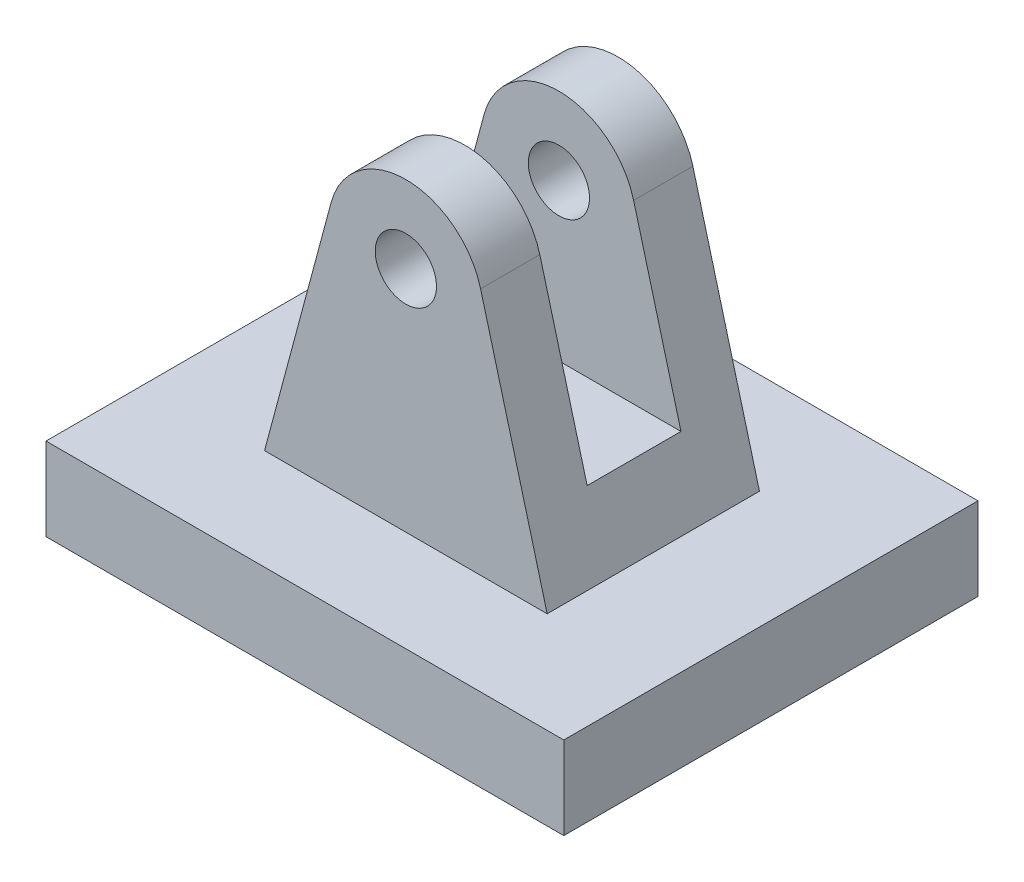
ISO-10303-21;
HEADER;
FILE_DESCRIPTION(('STEP AP214'),'2;1');
FILE_NAME('part.step','',(''),(''),'','','');
FILE_SCHEMA(('AUTOMOTIVE_DESIGN { 1 0 10303 214 1 1 1 1 }'));
ENDSEC;
DATA;
#1=APPLICATION_CONTEXT('core data for automotive mechanical design processes');
#2=APPLICATION_PROTOCOL_DEFINITION('international standard','automotive_design',2000,#1);
#3=PRODUCT_CONTEXT('',#1,'mechanical');
#4=PRODUCT('Part','Part','',(#3));
#5=PRODUCT_RELATED_PRODUCT_CATEGORY('part','',(#4));
#6=PRODUCT_DEFINITION_FORMATION('','',#4);
#7=PRODUCT_DEFINITION_CONTEXT('part definition',#1,'design');
#8=PRODUCT_DEFINITION('design','',#6,#7);
#9=PRODUCT_DEFINITION_SHAPE('','',#8);
#10=(LENGTH_UNIT() NAMED_UNIT(*) SI_UNIT(.MILLI.,.METRE.));
#11=(NAMED_UNIT(*) PLANE_ANGLE_UNIT() SI_UNIT($,.RADIAN.));
#12=(NAMED_UNIT(*) SI_UNIT($,.STERADIAN.) SOLID_ANGLE_UNIT());
#13=UNCERTAINTY_MEASURE_WITH_UNIT(LENGTH_MEASURE(1.E-05),#10,'distance_accuracy_value','');
#14=(GEOMETRIC_REPRESENTATION_CONTEXT(3) GLOBAL_UNCERTAINTY_ASSIGNED_CONTEXT((#13)) GLOBAL_UNIT_ASSIGNED_CONTEXT((#10,
#11,#12)) REPRESENTATION_CONTEXT('',''));
#15=CARTESIAN_POINT('',(0.,0.,0.));
#16=DIRECTION('',(0.,0.,1.));
#17=DIRECTION('',(1.,0.,0.));
#18=AXIS2_PLACEMENT_3D('',#15,#16,#17);
#19=CARTESIAN_POINT('',(0.,60.0546577360207,20.4999999999999));
#20=DIRECTION('',(0.,0.,-1.));
#21=DIRECTION('',(-1.,0.,0.));
#22=AXIS2_PLACEMENT_3D('',#19,#20,#21);
#23=CYLINDRICAL_SURFACE('',#22,14.9453422639793);
#24=CARTESIAN_POINT('',(0.,60.0546577360207,9.05925673640586));
#25=DIRECTION('',(0.,0.,1.));
#26=DIRECTION('',(0.,-1.,0.));
#27=AXIS2_PLACEMENT_3D('',#24,#25,#26);
#28=CIRCLE('',#27,14.9453422639793);
#29=CARTESIAN_POINT('',(14.4347987885931,63.9276203385145,9.05925673640586));
#30=VERTEX_POINT('',#29);
#31=CARTESIAN_POINT('',(-14.4347987885932,63.9276203385145,9.05925673640586));
#32=VERTEX_POINT('',#31);
#33=EDGE_CURVE('E158',#30,#32,#28,.T.);
#34=ORIENTED_EDGE('',*,*,#33,.T.);
#35=DIRECTION('',(0.,0.,-1.));
#36=VECTOR('',#35,1.);
#37=CARTESIAN_POINT('',(-14.4347987885932,63.9276203385145,20.4999999999999));
#38=LINE('',#37,#36);
#39=CARTESIAN_POINT('',(-14.4347987885932,63.9276203385145,20.4999999999999));
#40=VERTEX_POINT('',#39);
#41=EDGE_CURVE('E185',#40,#32,#38,.T.);
#42=ORIENTED_EDGE('',*,*,#41,.F.);
#43=CARTESIAN_POINT('',(0.,60.0546577360207,20.4999999999999));
#44=DIRECTION('',(0.,0.,1.));
#45=DIRECTION('',(-1.,0.,0.));
#46=AXIS2_PLACEMENT_3D('',#43,#44,#45);
#47=CIRCLE('',#46,14.9453422639793);
#48=CARTESIAN_POINT('',(14.4347987885931,63.9276203385145,20.4999999999999));
#49=VERTEX_POINT('',#48);
#50=EDGE_CURVE('E170',#49,#40,#47,.T.);
#51=ORIENTED_EDGE('',*,*,#50,.F.);
#52=DIRECTION('',(0.,0.,-1.));
#53=VECTOR('',#52,1.);
#54=CARTESIAN_POINT('',(14.4347987885931,63.9276203385145,20.4999999999999));
#55=LINE('',#54,#53);
#56=EDGE_CURVE('E188',#49,#30,#55,.T.);
#57=ORIENTED_EDGE('',*,*,#56,.T.);
#58=EDGE_LOOP('',(#34,#42,#51,#57));
#59=FACE_BOUND('',#58,.T.);
#60=ADVANCED_FACE('F37',(#59),#23,.T.);
#61=CARTESIAN_POINT('',(0.,60.0546577360207,-40.));
#62=DIRECTION('',(0.,0.,1.));
#63=DIRECTION('',(1.,0.,0.));
#64=AXIS2_PLACEMENT_3D('',#61,#62,#63);
#65=CYLINDRICAL_SURFACE('',#64,5.91181516522053);
#66=CARTESIAN_POINT('',(0.,60.0546577360207,9.05925673640586));
#67=DIRECTION('',(0.,0.,1.));
#68=DIRECTION('',(0.,-1.,0.));
#69=AXIS2_PLACEMENT_3D('',#66,#67,#68);
#70=CIRCLE('',#69,5.91181516522053);
#71=CARTESIAN_POINT('',(0.,54.1428425708002,9.05925673640586));
#72=VERTEX_POINT('',#71);
#73=EDGE_CURVE('E148',#72,#72,#70,.F.);
#74=ORIENTED_EDGE('',*,*,#73,.T.);
#75=EDGE_LOOP('',(#74));
#76=FACE_BOUND('',#75,.T.);
#77=CARTESIAN_POINT('',(0.,60.0546577360207,20.4999999999999));
#78=DIRECTION('',(0.,0.,1.));
#79=DIRECTION('',(1.,0.,0.));
#80=AXIS2_PLACEMENT_3D('',#77,#78,#79);
#81=CIRCLE('',#80,5.91181516522053);
#82=CARTESIAN_POINT('',(5.91181516522051,60.0546577360207,20.4999999999999));
#83=VERTEX_POINT('',#82);
#84=EDGE_CURVE('E133',#83,#83,#81,.T.);
#85=ORIENTED_EDGE('',*,*,#84,.T.);
#86=EDGE_LOOP('',(#85));
#87=FACE_BOUND('',#86,.T.);
#88=ADVANCED_FACE('F266',(#76,#87),#65,.F.);
#89=CARTESIAN_POINT('',(50.,16.,40.));
#90=DIRECTION('',(-1.,0.,0.));
#91=DIRECTION('',(0.,0.,1.));
#92=AXIS2_PLACEMENT_3D('',#89,#90,#91);
#93=PLANE('',#92);
#94=DIRECTION('',(0.,0.,-1.));
#95=VECTOR('',#94,1.);
#96=CARTESIAN_POINT('',(50.,0.,40.));
#97=LINE('',#96,#95);
#98=CARTESIAN_POINT('',(50.,0.,40.));
#99=VERTEX_POINT('',#98);
#100=CARTESIAN_POINT('',(50.,0.,-40.));
#101=VERTEX_POINT('',#100);
#102=EDGE_CURVE('E194',#99,#101,#97,.T.);
#103=ORIENTED_EDGE('',*,*,#102,.T.);
#104=DIRECTION('',(0.,-1.,0.));
#105=VECTOR('',#104,1.);
#106=CARTESIAN_POINT('',(50.,16.,-40.));
#107=LINE('',#106,#105);
#108=CARTESIAN_POINT('',(50.,16.,-40.));
#109=VERTEX_POINT('',#108);
#110=EDGE_CURVE('E45',#109,#101,#107,.T.);
#111=ORIENTED_EDGE('',*,*,#110,.F.);
#112=DIRECTION('',(0.,0.,-1.));
#113=VECTOR('',#112,1.);
#114=CARTESIAN_POINT('',(50.,16.,40.));
#115=LINE('',#114,#113);
#116=CARTESIAN_POINT('',(50.,16.,40.));
#117=VERTEX_POINT('',#116);
#118=EDGE_CURVE('E195',#117,#109,#115,.T.);
#119=ORIENTED_EDGE('',*,*,#118,.F.);
#120=DIRECTION('',(0.,-1.,0.));
#121=VECTOR('',#120,1.);
#122=CARTESIAN_POINT('',(50.,16.,40.));
#123=LINE('',#122,#121);
#124=EDGE_CURVE('E205',#117,#99,#123,.T.);
#125=ORIENTED_EDGE('',*,*,#124,.T.);
#126=EDGE_LOOP('',(#103,#111,#119,#125));
#127=FACE_BOUND('',#126,.T.);
#128=ADVANCED_FACE('F39',(#127),#93,.F.);
#129=CARTESIAN_POINT('',(-50.,16.,-40.));
#130=DIRECTION('',(0.,0.,1.));
#131=DIRECTION('',(1.,0.,0.));
#132=AXIS2_PLACEMENT_3D('',#129,#130,#131);
#133=PLANE('',#132);
#134=DIRECTION('',(-1.,0.,0.));
#135=VECTOR('',#134,1.);
#136=CARTESIAN_POINT('',(-50.,0.,-40.));
#137=LINE('',#136,#135);
#138=CARTESIAN_POINT('',(-50.,0.,-40.));
#139=VERTEX_POINT('',#138);
#140=EDGE_CURVE('E208',#101,#139,#137,.T.);
#141=ORIENTED_EDGE('',*,*,#140,.T.);
#142=DIRECTION('',(0.,-1.,0.));
#143=VECTOR('',#142,1.);
#144=CARTESIAN_POINT('',(-50.,16.,-40.));
#145=LINE('',#144,#143);
#146=CARTESIAN_POINT('',(-50.,16.,-40.));
#147=VERTEX_POINT('',#146);
#148=EDGE_CURVE('E218',#147,#139,#145,.T.);
#149=ORIENTED_EDGE('',*,*,#148,.F.);
#150=DIRECTION('',(-1.,0.,0.));
#151=VECTOR('',#150,1.);
#152=CARTESIAN_POINT('',(-50.,16.,-40.));
#153=LINE('',#152,#151);
#154=EDGE_CURVE('E198',#109,#147,#153,.T.);
#155=ORIENTED_EDGE('',*,*,#154,.F.);
#156=ORIENTED_EDGE('',*,*,#110,.T.);
#157=EDGE_LOOP('',(#141,#149,#155,#156));
#158=FACE_BOUND('',#157,.T.);
#159=ADVANCED_FACE('F294',(#158),#133,.F.);
#160=CARTESIAN_POINT('',(-50.,16.,40.));
#161=DIRECTION('',(1.,0.,0.));
#162=DIRECTION('',(0.,0.,-1.));
#163=AXIS2_PLACEMENT_3D('',#160,#161,#162);
#164=PLANE('',#163);
#165=DIRECTION('',(0.,0.,1.));
#166=VECTOR('',#165,1.);
#167=CARTESIAN_POINT('',(-50.,0.,40.));
#168=LINE('',#167,#166);
#169=CARTESIAN_POINT('',(-50.,0.,40.));
#170=VERTEX_POINT('',#169);
#171=EDGE_CURVE('E210',#139,#170,#168,.T.);
#172=ORIENTED_EDGE('',*,*,#171,.T.);
#173=DIRECTION('',(0.,-1.,0.));
#174=VECTOR('',#173,1.);
#175=CARTESIAN_POINT('',(-50.,16.,40.));
#176=LINE('',#175,#174);
#177=CARTESIAN_POINT('',(-50.,16.,40.));
#178=VERTEX_POINT('',#177);
#179=EDGE_CURVE('E215',#178,#170,#176,.T.);
#180=ORIENTED_EDGE('',*,*,#179,.F.);
#181=DIRECTION('',(0.,0.,1.));
#182=VECTOR('',#181,1.);
#183=CARTESIAN_POINT('',(-50.,16.,40.));
#184=LINE('',#183,#182);
#185=EDGE_CURVE('E201',#147,#178,#184,.T.);
#186=ORIENTED_EDGE('',*,*,#185,.F.);
#187=ORIENTED_EDGE('',*,*,#148,.T.);
#188=EDGE_LOOP('',(#172,#180,#186,#187));
#189=FACE_BOUND('',#188,.T.);
#190=ADVANCED_FACE('F291',(#189),#164,.F.);
#191=CARTESIAN_POINT('',(-50.,16.,40.));
#192=DIRECTION('',(0.,0.,-1.));
#193=DIRECTION('',(-1.,0.,0.));
#194=AXIS2_PLACEMENT_3D('',#191,#192,#193);
#195=PLANE('',#194);
#196=DIRECTION('',(1.,0.,0.));
#197=VECTOR('',#196,1.);
#198=CARTESIAN_POINT('',(-50.,0.,40.));
#199=LINE('',#198,#197);
#200=EDGE_CURVE('E199',#170,#99,#199,.T.);
#201=ORIENTED_EDGE('',*,*,#200,.T.);
#202=ORIENTED_EDGE('',*,*,#124,.F.);
#203=DIRECTION('',(1.,0.,0.));
#204=VECTOR('',#203,1.);
#205=CARTESIAN_POINT('',(-50.,16.,40.));
#206=LINE('',#205,#204);
#207=EDGE_CURVE('E203',#178,#117,#206,.T.);
#208=ORIENTED_EDGE('',*,*,#207,.F.);
#209=ORIENTED_EDGE('',*,*,#179,.T.);
#210=EDGE_LOOP('',(#201,#202,#208,#209));
#211=FACE_BOUND('',#210,.T.);
#212=ADVANCED_FACE('F287',(#211),#195,.F.);
#213=CARTESIAN_POINT('',(0.,16.,0.));
#214=DIRECTION('',(0.,-1.,0.));
#215=DIRECTION('',(0.,0.,-1.));
#216=AXIS2_PLACEMENT_3D('',#213,#214,#215);
#217=PLANE('',#216);
#218=DIRECTION('',(0.,0.,-1.));
#219=VECTOR('',#218,1.);
#220=CARTESIAN_POINT('',(-27.2941315660109,16.,20.4999999999999));
#221=LINE('',#220,#219);
#222=CARTESIAN_POINT('',(-27.2941315660109,16.,20.4999999999999));
#223=VERTEX_POINT('',#222);
#224=CARTESIAN_POINT('',(-27.2941315660109,16.,-20.4999999999999));
#225=VERTEX_POINT('',#224);
#226=EDGE_CURVE('E174',#223,#225,#221,.T.);
#227=ORIENTED_EDGE('',*,*,#226,.T.);
#228=DIRECTION('',(1.,0.,0.));
#229=VECTOR('',#228,1.);
#230=CARTESIAN_POINT('',(-27.2941315660109,16.,-20.4999999999999));
#231=LINE('',#230,#229);
#232=CARTESIAN_POINT('',(27.2941315660109,16.,-20.4999999999999));
#233=VERTEX_POINT('',#232);
#234=EDGE_CURVE('E60',#225,#233,#231,.T.);
#235=ORIENTED_EDGE('',*,*,#234,.T.);
#236=DIRECTION('',(0.,0.,-1.));
#237=VECTOR('',#236,1.);
#238=CARTESIAN_POINT('',(27.2941315660109,16.,20.4999999999999));
#239=LINE('',#238,#237);
#240=CARTESIAN_POINT('',(27.2941315660109,16.,20.4999999999999));
#241=VERTEX_POINT('',#240);
#242=EDGE_CURVE('E191',#241,#233,#239,.T.);
#243=ORIENTED_EDGE('',*,*,#242,.F.);
#244=DIRECTION('',(1.,0.,0.));
#245=VECTOR('',#244,1.);
#246=CARTESIAN_POINT('',(-27.2941315660109,16.,20.4999999999999));
#247=LINE('',#246,#245);
#248=EDGE_CURVE('E164',#223,#241,#247,.T.);
#249=ORIENTED_EDGE('',*,*,#248,.F.);
#250=EDGE_LOOP('',(#227,#235,#243,#249));
#251=FACE_BOUND('',#250,.T.);
#252=ORIENTED_EDGE('',*,*,#118,.T.);
#253=ORIENTED_EDGE('',*,*,#154,.T.);
#254=ORIENTED_EDGE('',*,*,#185,.T.);
#255=ORIENTED_EDGE('',*,*,#207,.T.);
#256=EDGE_LOOP('',(#252,#253,#254,#255));
#257=FACE_BOUND('',#256,.T.);
#258=ADVANCED_FACE('F240',(#251,#257),#217,.F.);
#259=CARTESIAN_POINT('',(0.,0.,0.));
#260=DIRECTION('',(0.,-1.,0.));
#261=DIRECTION('',(0.,0.,-1.));
#262=AXIS2_PLACEMENT_3D('',#259,#260,#261);
#263=PLANE('',#262);
#264=ORIENTED_EDGE('',*,*,#102,.F.);
#265=ORIENTED_EDGE('',*,*,#200,.F.);
#266=ORIENTED_EDGE('',*,*,#171,.F.);
#267=ORIENTED_EDGE('',*,*,#140,.F.);
#268=EDGE_LOOP('',(#264,#265,#266,#267));
#269=FACE_BOUND('',#268,.T.);
#270=ADVANCED_FACE('F279',(#269),#263,.T.);
#271=CARTESIAN_POINT('',(14.4347987885931,63.9276203385145,20.4999999999999));
#272=DIRECTION('',(-0.965839291843009,-0.259141780367803,0.));
#273=DIRECTION('',(0.259141780367803,-0.965839291843009,0.));
#274=AXIS2_PLACEMENT_3D('',#271,#272,#273);
#275=PLANE('',#274);
#276=DIRECTION('',(0.,0.,1.));
#277=VECTOR('',#276,1.);
#278=CARTESIAN_POINT('',(23.5746308125896,29.8628358908206,20.4999999999999));
#279=LINE('',#278,#277);
#280=CARTESIAN_POINT('',(23.5746308125896,29.8628358908206,-9.05925673640587));
#281=VERTEX_POINT('',#280);
#282=CARTESIAN_POINT('',(23.5746308125896,29.8628358908206,9.05925673640587));
#283=VERTEX_POINT('',#282);
#284=EDGE_CURVE('E126',#281,#283,#279,.T.);
#285=ORIENTED_EDGE('',*,*,#284,.T.);
#286=DIRECTION('',(-0.259141780367804,0.965839291843009,0.));
#287=VECTOR('',#286,1.);
#288=CARTESIAN_POINT('',(14.4347987885931,63.9276203385145,9.05925673640586));
#289=LINE('',#288,#287);
#290=EDGE_CURVE('E134',#283,#30,#289,.T.);
#291=ORIENTED_EDGE('',*,*,#290,.T.);
#292=ORIENTED_EDGE('',*,*,#56,.F.);
#293=DIRECTION('',(-0.259141780367803,0.965839291843009,0.));
#294=VECTOR('',#293,1.);
#295=CARTESIAN_POINT('',(14.4347987885931,63.9276203385145,20.4999999999999));
#296=LINE('',#295,#294);
#297=EDGE_CURVE('E167',#241,#49,#296,.T.);
#298=ORIENTED_EDGE('',*,*,#297,.F.);
#299=ORIENTED_EDGE('',*,*,#242,.T.);
#300=DIRECTION('',(-0.259141780367803,0.965839291843009,0.));
#301=VECTOR('',#300,1.);
#302=CARTESIAN_POINT('',(14.4347987885931,63.9276203385145,-20.4999999999999));
#303=LINE('',#302,#301);
#304=CARTESIAN_POINT('',(14.4347987885931,63.9276203385145,-20.4999999999999));
#305=VERTEX_POINT('',#304);
#306=EDGE_CURVE('E176',#233,#305,#303,.T.);
#307=ORIENTED_EDGE('',*,*,#306,.T.);
#308=CARTESIAN_POINT('',(14.4347987885931,63.9276203385145,-9.05925673640587));
#309=VERTEX_POINT('',#308);
#310=EDGE_CURVE('E147',#309,#305,#55,.T.);
#311=ORIENTED_EDGE('',*,*,#310,.F.);
#312=DIRECTION('',(0.259141780367804,-0.965839291843009,0.));
#313=VECTOR('',#312,1.);
#314=CARTESIAN_POINT('',(14.4347987885931,63.9276203385145,-9.05925673640587));
#315=LINE('',#314,#313);
#316=EDGE_CURVE('E138',#309,#281,#315,.T.);
#317=ORIENTED_EDGE('',*,*,#316,.T.);
#318=EDGE_LOOP('',(#285,#291,#292,#298,#299,#307,#311,#317));
#319=FACE_BOUND('',#318,.T.);
#320=ADVANCED_FACE('F145',(#319),#275,.F.);
#321=CARTESIAN_POINT('',(-14.4347987885932,63.9276203385145,-9.05925673640587));
#322=VERTEX_POINT('',#321);
#323=CARTESIAN_POINT('',(-14.4347987885932,63.9276203385145,-20.4999999999999));
#324=VERTEX_POINT('',#323);
#325=EDGE_CURVE('E184',#322,#324,#38,.T.);
#326=ORIENTED_EDGE('',*,*,#325,.F.);
#327=CARTESIAN_POINT('',(0.,60.0546577360207,-9.05925673640587));
#328=DIRECTION('',(0.,0.,-1.));
#329=DIRECTION('',(0.,1.,0.));
#330=AXIS2_PLACEMENT_3D('',#327,#328,#329);
#331=CIRCLE('',#330,14.9453422639793);
#332=EDGE_CURVE('E149',#322,#309,#331,.T.);
#333=ORIENTED_EDGE('',*,*,#332,.T.);
#334=ORIENTED_EDGE('',*,*,#310,.T.);
#335=CARTESIAN_POINT('',(0.,60.0546577360207,-20.4999999999999));
#336=DIRECTION('',(0.,0.,1.));
#337=DIRECTION('',(-1.,0.,0.));
#338=AXIS2_PLACEMENT_3D('',#335,#336,#337);
#339=CIRCLE('',#338,14.9453422639793);
#340=EDGE_CURVE('E178',#305,#324,#339,.T.);
#341=ORIENTED_EDGE('',*,*,#340,.T.);
#342=EDGE_LOOP('',(#326,#333,#334,#341));
#343=FACE_BOUND('',#342,.T.);
#344=ADVANCED_FACE('F233',(#343),#23,.T.);
#345=CARTESIAN_POINT('',(-27.2941315660109,16.,20.4999999999999));
#346=DIRECTION('',(0.965839291843009,-0.259141780367803,0.));
#347=DIRECTION('',(0.259141780367803,0.965839291843009,0.));
#348=AXIS2_PLACEMENT_3D('',#345,#346,#347);
#349=PLANE('',#348);
#350=ORIENTED_EDGE('',*,*,#41,.T.);
#351=DIRECTION('',(-0.259141780367803,-0.965839291843009,0.));
#352=VECTOR('',#351,1.);
#353=CARTESIAN_POINT('',(-27.2941315660109,16.,9.05925673640587));
#354=LINE('',#353,#352);
#355=CARTESIAN_POINT('',(-23.5746308125897,29.8628358908206,9.05925673640587));
#356=VERTEX_POINT('',#355);
#357=EDGE_CURVE('E152',#32,#356,#354,.T.);
#358=ORIENTED_EDGE('',*,*,#357,.T.);
#359=DIRECTION('',(0.,0.,-1.));
#360=VECTOR('',#359,1.);
#361=CARTESIAN_POINT('',(-23.5746308125897,29.8628358908206,20.4999999999999));
#362=LINE('',#361,#360);
#363=CARTESIAN_POINT('',(-23.5746308125897,29.8628358908206,-9.05925673640587));
#364=VERTEX_POINT('',#363);
#365=EDGE_CURVE('E11',#356,#364,#362,.T.);
#366=ORIENTED_EDGE('',*,*,#365,.T.);
#367=DIRECTION('',(0.259141780367803,0.965839291843009,0.));
#368=VECTOR('',#367,1.);
#369=CARTESIAN_POINT('',(-27.2941315660109,16.,-9.05925673640588));
#370=LINE('',#369,#368);
#371=EDGE_CURVE('E141',#364,#322,#370,.T.);
#372=ORIENTED_EDGE('',*,*,#371,.T.);
#373=ORIENTED_EDGE('',*,*,#325,.T.);
#374=DIRECTION('',(-0.259141780367803,-0.965839291843009,0.));
#375=VECTOR('',#374,1.);
#376=CARTESIAN_POINT('',(-27.2941315660109,16.,-20.4999999999999));
#377=LINE('',#376,#375);
#378=EDGE_CURVE('E168',#324,#225,#377,.T.);
#379=ORIENTED_EDGE('',*,*,#378,.T.);
#380=ORIENTED_EDGE('',*,*,#226,.F.);
#381=DIRECTION('',(-0.259141780367803,-0.965839291843009,0.));
#382=VECTOR('',#381,1.);
#383=CARTESIAN_POINT('',(-27.2941315660109,16.,20.4999999999999));
#384=LINE('',#383,#382);
#385=EDGE_CURVE('E172',#40,#223,#384,.T.);
#386=ORIENTED_EDGE('',*,*,#385,.F.);
#387=EDGE_LOOP('',(#350,#358,#366,#372,#373,#379,#380,#386));
#388=FACE_BOUND('',#387,.T.);
#389=ADVANCED_FACE('F231',(#388),#349,.F.);
#390=CARTESIAN_POINT('',(0.,60.0546577360207,20.4999999999999));
#391=DIRECTION('',(0.,0.,-1.));
#392=DIRECTION('',(-1.,0.,0.));
#393=AXIS2_PLACEMENT_3D('',#390,#391,#392);
#394=PLANE('',#393);
#395=ORIENTED_EDGE('',*,*,#84,.F.);
#396=EDGE_LOOP('',(#395));
#397=FACE_BOUND('',#396,.T.);
#398=ORIENTED_EDGE('',*,*,#248,.T.);
#399=ORIENTED_EDGE('',*,*,#297,.T.);
#400=ORIENTED_EDGE('',*,*,#50,.T.);
#401=ORIENTED_EDGE('',*,*,#385,.T.);
#402=EDGE_LOOP('',(#398,#399,#400,#401));
#403=FACE_BOUND('',#402,.T.);
#404=ADVANCED_FACE('F244',(#397,#403),#394,.F.);
#405=CARTESIAN_POINT('',(0.,60.0546577360207,-20.4999999999999));
#406=DIRECTION('',(0.,0.,-1.));
#407=DIRECTION('',(-1.,0.,0.));
#408=AXIS2_PLACEMENT_3D('',#405,#406,#407);
#409=PLANE('',#408);
#410=CARTESIAN_POINT('',(0.,60.0546577360207,-20.4999999999999));
#411=DIRECTION('',(0.,0.,-1.));
#412=DIRECTION('',(-1.,0.,0.));
#413=AXIS2_PLACEMENT_3D('',#410,#411,#412);
#414=CIRCLE('',#413,5.91181516522053);
#415=CARTESIAN_POINT('',(-5.91181516522056,60.0546577360207,-20.4999999999999));
#416=VERTEX_POINT('',#415);
#417=EDGE_CURVE('E163',#416,#416,#414,.T.);
#418=ORIENTED_EDGE('',*,*,#417,.F.);
#419=EDGE_LOOP('',(#418));
#420=FACE_BOUND('',#419,.T.);
#421=ORIENTED_EDGE('',*,*,#234,.F.);
#422=ORIENTED_EDGE('',*,*,#378,.F.);
#423=ORIENTED_EDGE('',*,*,#340,.F.);
#424=ORIENTED_EDGE('',*,*,#306,.F.);
#425=EDGE_LOOP('',(#421,#422,#423,#424));
#426=FACE_BOUND('',#425,.T.);
#427=ADVANCED_FACE('F235',(#420,#426),#409,.T.);
#428=CARTESIAN_POINT('',(0.,60.0546577360207,-9.05925673640587));
#429=DIRECTION('',(0.,0.,-1.));
#430=DIRECTION('',(0.,1.,0.));
#431=AXIS2_PLACEMENT_3D('',#428,#429,#430);
#432=CIRCLE('',#431,5.91181516522053);
#433=CARTESIAN_POINT('',(0.,65.9664729012413,-9.05925673640586));
#434=VERTEX_POINT('',#433);
#435=EDGE_CURVE('E142',#434,#434,#432,.F.);
#436=ORIENTED_EDGE('',*,*,#435,.T.);
#437=EDGE_LOOP('',(#436));
#438=FACE_BOUND('',#437,.T.);
#439=ORIENTED_EDGE('',*,*,#417,.T.);
#440=EDGE_LOOP('',(#439));
#441=FACE_BOUND('',#440,.T.);
#442=ADVANCED_FACE('F261',(#438,#441),#65,.F.);
#443=CARTESIAN_POINT('',(-50.,29.8628358908206,9.05925673640587));
#444=DIRECTION('',(0.,-1.,0.));
#445=DIRECTION('',(0.,0.,-1.));
#446=AXIS2_PLACEMENT_3D('',#443,#444,#445);
#447=PLANE('',#446);
#448=DIRECTION('',(1.,0.,0.));
#449=VECTOR('',#448,1.);
#450=CARTESIAN_POINT('',(-50.,29.8628358908206,-9.05925673640587));
#451=LINE('',#450,#449);
#452=EDGE_CURVE('E52',#364,#281,#451,.T.);
#453=ORIENTED_EDGE('',*,*,#452,.F.);
#454=ORIENTED_EDGE('',*,*,#365,.F.);
#455=DIRECTION('',(1.,0.,0.));
#456=VECTOR('',#455,1.);
#457=CARTESIAN_POINT('',(-50.,29.8628358908206,9.05925673640587));
#458=LINE('',#457,#456);
#459=EDGE_CURVE('E129',#356,#283,#458,.T.);
#460=ORIENTED_EDGE('',*,*,#459,.T.);
#461=ORIENTED_EDGE('',*,*,#284,.F.);
#462=EDGE_LOOP('',(#453,#454,#460,#461));
#463=FACE_BOUND('',#462,.T.);
#464=ADVANCED_FACE('F127',(#463),#447,.F.);
#465=CARTESIAN_POINT('',(-50.,75.,9.05925673640586));
#466=DIRECTION('',(0.,0.,1.));
#467=DIRECTION('',(0.,-1.,0.));
#468=AXIS2_PLACEMENT_3D('',#465,#466,#467);
#469=PLANE('',#468);
#470=ORIENTED_EDGE('',*,*,#73,.F.);
#471=EDGE_LOOP('',(#470));
#472=FACE_BOUND('',#471,.T.);
#473=ORIENTED_EDGE('',*,*,#459,.F.);
#474=ORIENTED_EDGE('',*,*,#357,.F.);
#475=ORIENTED_EDGE('',*,*,#33,.F.);
#476=ORIENTED_EDGE('',*,*,#290,.F.);
#477=EDGE_LOOP('',(#473,#474,#475,#476));
#478=FACE_BOUND('',#477,.T.);
#479=ADVANCED_FACE('F251',(#472,#478),#469,.F.);
#480=CARTESIAN_POINT('',(-50.,75.,-9.05925673640586));
#481=DIRECTION('',(0.,0.,-1.));
#482=DIRECTION('',(0.,1.,0.));
#483=AXIS2_PLACEMENT_3D('',#480,#481,#482);
#484=PLANE('',#483);
#485=ORIENTED_EDGE('',*,*,#435,.F.);
#486=EDGE_LOOP('',(#485));
#487=FACE_BOUND('',#486,.T.);
#488=ORIENTED_EDGE('',*,*,#332,.F.);
#489=ORIENTED_EDGE('',*,*,#371,.F.);
#490=ORIENTED_EDGE('',*,*,#452,.T.);
#491=ORIENTED_EDGE('',*,*,#316,.F.);
#492=EDGE_LOOP('',(#488,#489,#490,#491));
#493=FACE_BOUND('',#492,.T.);
#494=ADVANCED_FACE('F137',(#487,#493),#484,.F.);
#495=CLOSED_SHELL('',(#60,#88,#128,#159,#190,#212,#258,#270,#320,#344,#389,#404,#427,#442,#464,
#479,#494));
#496=MANIFOLD_SOLID_BREP('B2',#495);
#497=ADVANCED_BREP_SHAPE_REPRESENTATION('',(#18,#496),#14);
#498=SHAPE_DEFINITION_REPRESENTATION(#9,#497);
ENDSEC;
END-ISO-10303-21;
